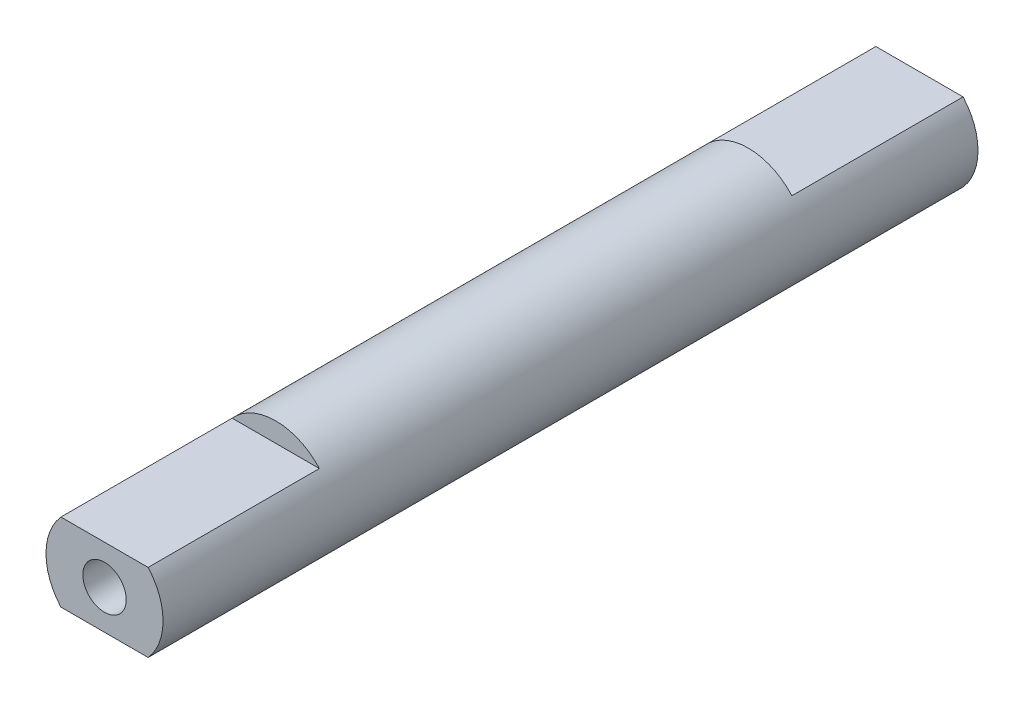
ISO-10303-21;
HEADER;
FILE_DESCRIPTION(('STEP AP214'),'2;1');
FILE_NAME('part.step','',(''),(''),'','','');
FILE_SCHEMA(('AUTOMOTIVE_DESIGN { 1 0 10303 214 1 1 1 1 }'));
ENDSEC;
DATA;
#1=APPLICATION_CONTEXT('core data for automotive mechanical design processes');
#2=APPLICATION_PROTOCOL_DEFINITION('international standard','automotive_design',2000,#1);
#3=PRODUCT_CONTEXT('',#1,'mechanical');
#4=PRODUCT('Part','Part','',(#3));
#5=PRODUCT_RELATED_PRODUCT_CATEGORY('part','',(#4));
#6=PRODUCT_DEFINITION_FORMATION('','',#4);
#7=PRODUCT_DEFINITION_CONTEXT('part definition',#1,'design');
#8=PRODUCT_DEFINITION('design','',#6,#7);
#9=PRODUCT_DEFINITION_SHAPE('','',#8);
#10=(LENGTH_UNIT() NAMED_UNIT(*) SI_UNIT(.MILLI.,.METRE.));
#11=(NAMED_UNIT(*) PLANE_ANGLE_UNIT() SI_UNIT($,.RADIAN.));
#12=(NAMED_UNIT(*) SI_UNIT($,.STERADIAN.) SOLID_ANGLE_UNIT());
#13=UNCERTAINTY_MEASURE_WITH_UNIT(LENGTH_MEASURE(1.E-05),#10,'distance_accuracy_value','');
#14=(GEOMETRIC_REPRESENTATION_CONTEXT(3) GLOBAL_UNCERTAINTY_ASSIGNED_CONTEXT((#13)) GLOBAL_UNIT_ASSIGNED_CONTEXT((#10,
#11,#12)) REPRESENTATION_CONTEXT('',''));
#15=CARTESIAN_POINT('',(0.,0.,0.));
#16=DIRECTION('',(0.,0.,1.));
#17=DIRECTION('',(1.,0.,0.));
#18=AXIS2_PLACEMENT_3D('',#15,#16,#17);
#19=CARTESIAN_POINT('',(0.,0.,18.8));
#20=DIRECTION('',(0.,0.,-1.));
#21=DIRECTION('',(-1.,0.,0.));
#22=AXIS2_PLACEMENT_3D('',#19,#20,#21);
#23=CYLINDRICAL_SURFACE('',#22,2.7);
#24=CARTESIAN_POINT('',(0.,0.,-10.9));
#25=DIRECTION('',(0.,0.,-1.));
#26=DIRECTION('',(-1.,0.,0.));
#27=AXIS2_PLACEMENT_3D('',#24,#25,#26);
#28=CIRCLE('',#27,2.7);
#29=CARTESIAN_POINT('',(-2.01246117974981,1.8,-10.9));
#30=VERTEX_POINT('',#29);
#31=CARTESIAN_POINT('',(2.01246117974981,1.8,-10.9));
#32=VERTEX_POINT('',#31);
#33=EDGE_CURVE('E138',#30,#32,#28,.T.);
#34=ORIENTED_EDGE('',*,*,#33,.F.);
#35=DIRECTION('',(0.,0.,-1.));
#36=VECTOR('',#35,1.);
#37=CARTESIAN_POINT('',(-2.01246117974981,1.8,-10.9));
#38=LINE('',#37,#36);
#39=CARTESIAN_POINT('',(-2.01246117974981,1.8,-18.8));
#40=VERTEX_POINT('',#39);
#41=EDGE_CURVE('E147',#30,#40,#38,.T.);
#42=ORIENTED_EDGE('',*,*,#41,.T.);
#43=CARTESIAN_POINT('',(0.,0.,-18.8));
#44=DIRECTION('',(0.,0.,1.));
#45=DIRECTION('',(1.,0.,0.));
#46=AXIS2_PLACEMENT_3D('',#43,#44,#45);
#47=CIRCLE('',#46,2.7);
#48=CARTESIAN_POINT('',(-2.01246117974981,-1.8,-18.8));
#49=VERTEX_POINT('',#48);
#50=EDGE_CURVE('E164',#40,#49,#47,.T.);
#51=ORIENTED_EDGE('',*,*,#50,.T.);
#52=DIRECTION('',(0.,0.,-1.));
#53=VECTOR('',#52,1.);
#54=CARTESIAN_POINT('',(-2.01246117974981,-1.8,-10.9));
#55=LINE('',#54,#53);
#56=CARTESIAN_POINT('',(-2.01246117974981,-1.8,-10.9));
#57=VERTEX_POINT('',#56);
#58=EDGE_CURVE('E152',#57,#49,#55,.T.);
#59=ORIENTED_EDGE('',*,*,#58,.F.);
#60=CARTESIAN_POINT('',(0.,0.,-10.9));
#61=DIRECTION('',(0.,0.,-1.));
#62=DIRECTION('',(-1.,0.,0.));
#63=AXIS2_PLACEMENT_3D('',#60,#61,#62);
#64=CIRCLE('',#63,2.7);
#65=CARTESIAN_POINT('',(2.01246117974981,-1.8,-10.9));
#66=VERTEX_POINT('',#65);
#67=EDGE_CURVE('E158',#66,#57,#64,.T.);
#68=ORIENTED_EDGE('',*,*,#67,.F.);
#69=DIRECTION('',(0.,0.,-1.));
#70=VECTOR('',#69,1.);
#71=CARTESIAN_POINT('',(2.01246117974981,-1.8,-10.9));
#72=LINE('',#71,#70);
#73=CARTESIAN_POINT('',(2.01246117974981,-1.8,-18.8));
#74=VERTEX_POINT('',#73);
#75=EDGE_CURVE('E124',#66,#74,#72,.T.);
#76=ORIENTED_EDGE('',*,*,#75,.T.);
#77=CARTESIAN_POINT('',(2.01246117974981,1.8,-18.8));
#78=VERTEX_POINT('',#77);
#79=EDGE_CURVE('E47',#74,#78,#47,.T.);
#80=ORIENTED_EDGE('',*,*,#79,.T.);
#81=DIRECTION('',(0.,0.,-1.));
#82=VECTOR('',#81,1.);
#83=CARTESIAN_POINT('',(2.01246117974981,1.8,-10.9));
#84=LINE('',#83,#82);
#85=EDGE_CURVE('E144',#32,#78,#84,.T.);
#86=ORIENTED_EDGE('',*,*,#85,.F.);
#87=EDGE_LOOP('',(#34,#42,#51,#59,#68,#76,#80,#86));
#88=FACE_BOUND('',#87,.T.);
#89=DIRECTION('',(0.,0.,1.));
#90=VECTOR('',#89,1.);
#91=CARTESIAN_POINT('',(2.01246117974981,1.8,10.9));
#92=LINE('',#91,#90);
#93=CARTESIAN_POINT('',(2.01246117974981,1.8,10.9));
#94=VERTEX_POINT('',#93);
#95=CARTESIAN_POINT('',(2.01246117974981,1.8,18.8));
#96=VERTEX_POINT('',#95);
#97=EDGE_CURVE('E112',#94,#96,#92,.T.);
#98=ORIENTED_EDGE('',*,*,#97,.T.);
#99=CARTESIAN_POINT('',(0.,0.,18.8));
#100=DIRECTION('',(0.,0.,1.));
#101=DIRECTION('',(1.,0.,0.));
#102=AXIS2_PLACEMENT_3D('',#99,#100,#101);
#103=CIRCLE('',#102,2.7);
#104=CARTESIAN_POINT('',(2.01246117974981,-1.8,18.8));
#105=VERTEX_POINT('',#104);
#106=EDGE_CURVE('E52',#105,#96,#103,.T.);
#107=ORIENTED_EDGE('',*,*,#106,.F.);
#108=DIRECTION('',(0.,0.,1.));
#109=VECTOR('',#108,1.);
#110=CARTESIAN_POINT('',(2.01246117974981,-1.8,10.9));
#111=LINE('',#110,#109);
#112=CARTESIAN_POINT('',(2.01246117974981,-1.8,10.9));
#113=VERTEX_POINT('',#112);
#114=EDGE_CURVE('E60',#113,#105,#111,.T.);
#115=ORIENTED_EDGE('',*,*,#114,.F.);
#116=CARTESIAN_POINT('',(0.,0.,10.9));
#117=DIRECTION('',(0.,0.,-1.));
#118=DIRECTION('',(-1.,0.,0.));
#119=AXIS2_PLACEMENT_3D('',#116,#117,#118);
#120=CIRCLE('',#119,2.7);
#121=CARTESIAN_POINT('',(-2.01246117974981,-1.8,10.9));
#122=VERTEX_POINT('',#121);
#123=EDGE_CURVE('E128',#113,#122,#120,.T.);
#124=ORIENTED_EDGE('',*,*,#123,.T.);
#125=DIRECTION('',(0.,0.,1.));
#126=VECTOR('',#125,1.);
#127=CARTESIAN_POINT('',(-2.01246117974981,-1.8,10.9));
#128=LINE('',#127,#126);
#129=CARTESIAN_POINT('',(-2.01246117974981,-1.8,18.8));
#130=VERTEX_POINT('',#129);
#131=EDGE_CURVE('E135',#122,#130,#128,.T.);
#132=ORIENTED_EDGE('',*,*,#131,.T.);
#133=CARTESIAN_POINT('',(-2.01246117974981,1.8,18.8));
#134=VERTEX_POINT('',#133);
#135=EDGE_CURVE('E11',#134,#130,#103,.T.);
#136=ORIENTED_EDGE('',*,*,#135,.F.);
#137=DIRECTION('',(0.,0.,1.));
#138=VECTOR('',#137,1.);
#139=CARTESIAN_POINT('',(-2.01246117974981,1.8,10.9));
#140=LINE('',#139,#138);
#141=CARTESIAN_POINT('',(-2.01246117974981,1.8,10.9));
#142=VERTEX_POINT('',#141);
#143=EDGE_CURVE('E68',#142,#134,#140,.T.);
#144=ORIENTED_EDGE('',*,*,#143,.F.);
#145=CARTESIAN_POINT('',(0.,0.,10.9));
#146=DIRECTION('',(0.,0.,-1.));
#147=DIRECTION('',(-1.,0.,0.));
#148=AXIS2_PLACEMENT_3D('',#145,#146,#147);
#149=CIRCLE('',#148,2.7);
#150=EDGE_CURVE('E115',#142,#94,#149,.T.);
#151=ORIENTED_EDGE('',*,*,#150,.T.);
#152=EDGE_LOOP('',(#98,#107,#115,#124,#132,#136,#144,#151));
#153=FACE_BOUND('',#152,.T.);
#154=ADVANCED_FACE('F43',(#88,#153),#23,.T.);
#155=CARTESIAN_POINT('',(0.,0.,18.8));
#156=DIRECTION('',(0.,0.,1.));
#157=DIRECTION('',(1.,0.,0.));
#158=AXIS2_PLACEMENT_3D('',#155,#156,#157);
#159=PLANE('',#158);
#160=CARTESIAN_POINT('',(0.,0.,18.8));
#161=DIRECTION('',(0.,0.,1.));
#162=DIRECTION('',(1.,0.,0.));
#163=AXIS2_PLACEMENT_3D('',#160,#161,#162);
#164=CIRCLE('',#163,1.);
#165=CARTESIAN_POINT('',(1.,0.,18.8));
#166=VERTEX_POINT('',#165);
#167=EDGE_CURVE('E162',#166,#166,#164,.T.);
#168=ORIENTED_EDGE('',*,*,#167,.F.);
#169=EDGE_LOOP('',(#168));
#170=FACE_BOUND('',#169,.T.);
#171=ORIENTED_EDGE('',*,*,#106,.T.);
#172=DIRECTION('',(-1.,0.,0.));
#173=VECTOR('',#172,1.);
#174=CARTESIAN_POINT('',(2.01246117974981,1.8,18.8));
#175=LINE('',#174,#173);
#176=EDGE_CURVE('E119',#96,#134,#175,.T.);
#177=ORIENTED_EDGE('',*,*,#176,.T.);
#178=ORIENTED_EDGE('',*,*,#135,.T.);
#179=DIRECTION('',(1.,0.,0.));
#180=VECTOR('',#179,1.);
#181=CARTESIAN_POINT('',(2.01246117974981,-1.8,18.8));
#182=LINE('',#181,#180);
#183=EDGE_CURVE('E132',#130,#105,#182,.T.);
#184=ORIENTED_EDGE('',*,*,#183,.T.);
#185=EDGE_LOOP('',(#171,#177,#178,#184));
#186=FACE_BOUND('',#185,.T.);
#187=ADVANCED_FACE('F200',(#170,#186),#159,.T.);
#188=CARTESIAN_POINT('',(0.,0.,18.8));
#189=DIRECTION('',(0.,0.,-1.));
#190=DIRECTION('',(-1.,0.,0.));
#191=AXIS2_PLACEMENT_3D('',#188,#189,#190);
#192=CYLINDRICAL_SURFACE('',#191,1.);
#193=ORIENTED_EDGE('',*,*,#167,.T.);
#194=EDGE_LOOP('',(#193));
#195=FACE_BOUND('',#194,.T.);
#196=CARTESIAN_POINT('',(0.,0.,-18.8));
#197=DIRECTION('',(0.,0.,1.));
#198=DIRECTION('',(1.,0.,0.));
#199=AXIS2_PLACEMENT_3D('',#196,#197,#198);
#200=CIRCLE('',#199,1.);
#201=CARTESIAN_POINT('',(1.,0.,-18.8));
#202=VERTEX_POINT('',#201);
#203=EDGE_CURVE('E150',#202,#202,#200,.T.);
#204=ORIENTED_EDGE('',*,*,#203,.F.);
#205=EDGE_LOOP('',(#204));
#206=FACE_BOUND('',#205,.T.);
#207=ADVANCED_FACE('F45',(#195,#206),#192,.F.);
#208=CARTESIAN_POINT('',(0.,0.,-18.8));
#209=DIRECTION('',(0.,0.,1.));
#210=DIRECTION('',(1.,0.,0.));
#211=AXIS2_PLACEMENT_3D('',#208,#209,#210);
#212=PLANE('',#211);
#213=ORIENTED_EDGE('',*,*,#203,.T.);
#214=EDGE_LOOP('',(#213));
#215=FACE_BOUND('',#214,.T.);
#216=ORIENTED_EDGE('',*,*,#50,.F.);
#217=DIRECTION('',(-1.,0.,0.));
#218=VECTOR('',#217,1.);
#219=CARTESIAN_POINT('',(2.01246117974981,1.8,-18.8));
#220=LINE('',#219,#218);
#221=EDGE_CURVE('E141',#78,#40,#220,.T.);
#222=ORIENTED_EDGE('',*,*,#221,.F.);
#223=ORIENTED_EDGE('',*,*,#79,.F.);
#224=DIRECTION('',(1.,0.,0.));
#225=VECTOR('',#224,1.);
#226=CARTESIAN_POINT('',(2.01246117974981,-1.8,-18.8));
#227=LINE('',#226,#225);
#228=EDGE_CURVE('E146',#49,#74,#227,.T.);
#229=ORIENTED_EDGE('',*,*,#228,.F.);
#230=EDGE_LOOP('',(#216,#222,#223,#229));
#231=FACE_BOUND('',#230,.T.);
#232=ADVANCED_FACE('F181',(#215,#231),#212,.F.);
#233=CARTESIAN_POINT('',(2.01246117974981,-1.8,-10.9));
#234=DIRECTION('',(0.,1.,0.));
#235=DIRECTION('',(0.,0.,1.));
#236=AXIS2_PLACEMENT_3D('',#233,#234,#235);
#237=PLANE('',#236);
#238=ORIENTED_EDGE('',*,*,#228,.T.);
#239=ORIENTED_EDGE('',*,*,#75,.F.);
#240=DIRECTION('',(1.,0.,0.));
#241=VECTOR('',#240,1.);
#242=CARTESIAN_POINT('',(2.01246117974981,-1.8,-10.9));
#243=LINE('',#242,#241);
#244=EDGE_CURVE('E154',#57,#66,#243,.T.);
#245=ORIENTED_EDGE('',*,*,#244,.F.);
#246=ORIENTED_EDGE('',*,*,#58,.T.);
#247=EDGE_LOOP('',(#238,#239,#245,#246));
#248=FACE_BOUND('',#247,.T.);
#249=ADVANCED_FACE('F183',(#248),#237,.F.);
#250=CARTESIAN_POINT('',(0.,0.,-10.9));
#251=DIRECTION('',(0.,0.,-1.));
#252=DIRECTION('',(-1.,0.,0.));
#253=AXIS2_PLACEMENT_3D('',#250,#251,#252);
#254=PLANE('',#253);
#255=ORIENTED_EDGE('',*,*,#67,.T.);
#256=ORIENTED_EDGE('',*,*,#244,.T.);
#257=EDGE_LOOP('',(#255,#256));
#258=FACE_BOUND('',#257,.T.);
#259=ADVANCED_FACE('F186',(#258),#254,.T.);
#260=CARTESIAN_POINT('',(2.01246117974981,1.8,-10.9));
#261=DIRECTION('',(0.,-1.,0.));
#262=DIRECTION('',(0.,0.,-1.));
#263=AXIS2_PLACEMENT_3D('',#260,#261,#262);
#264=PLANE('',#263);
#265=ORIENTED_EDGE('',*,*,#221,.T.);
#266=ORIENTED_EDGE('',*,*,#41,.F.);
#267=DIRECTION('',(-1.,0.,0.));
#268=VECTOR('',#267,1.);
#269=CARTESIAN_POINT('',(2.01246117974981,1.8,-10.9));
#270=LINE('',#269,#268);
#271=EDGE_CURVE('E140',#32,#30,#270,.T.);
#272=ORIENTED_EDGE('',*,*,#271,.F.);
#273=ORIENTED_EDGE('',*,*,#85,.T.);
#274=EDGE_LOOP('',(#265,#266,#272,#273));
#275=FACE_BOUND('',#274,.T.);
#276=ADVANCED_FACE('F188',(#275),#264,.F.);
#277=CARTESIAN_POINT('',(0.,0.,-10.9));
#278=DIRECTION('',(0.,0.,-1.));
#279=DIRECTION('',(-1.,0.,0.));
#280=AXIS2_PLACEMENT_3D('',#277,#278,#279);
#281=PLANE('',#280);
#282=ORIENTED_EDGE('',*,*,#33,.T.);
#283=ORIENTED_EDGE('',*,*,#271,.T.);
#284=EDGE_LOOP('',(#282,#283));
#285=FACE_BOUND('',#284,.T.);
#286=ADVANCED_FACE('F194',(#285),#281,.T.);
#287=CARTESIAN_POINT('',(2.01246117974981,-1.8,10.9));
#288=DIRECTION('',(0.,-1.,0.));
#289=DIRECTION('',(0.,0.,-1.));
#290=AXIS2_PLACEMENT_3D('',#287,#288,#289);
#291=PLANE('',#290);
#292=ORIENTED_EDGE('',*,*,#183,.F.);
#293=ORIENTED_EDGE('',*,*,#131,.F.);
#294=DIRECTION('',(1.,0.,0.));
#295=VECTOR('',#294,1.);
#296=CARTESIAN_POINT('',(2.01246117974981,-1.8,10.9));
#297=LINE('',#296,#295);
#298=EDGE_CURVE('E131',#122,#113,#297,.T.);
#299=ORIENTED_EDGE('',*,*,#298,.T.);
#300=ORIENTED_EDGE('',*,*,#114,.T.);
#301=EDGE_LOOP('',(#292,#293,#299,#300));
#302=FACE_BOUND('',#301,.T.);
#303=ADVANCED_FACE('F222',(#302),#291,.T.);
#304=CARTESIAN_POINT('',(0.,0.,10.9));
#305=DIRECTION('',(0.,0.,1.));
#306=DIRECTION('',(-1.,0.,0.));
#307=AXIS2_PLACEMENT_3D('',#304,#305,#306);
#308=PLANE('',#307);
#309=ORIENTED_EDGE('',*,*,#123,.F.);
#310=ORIENTED_EDGE('',*,*,#298,.F.);
#311=EDGE_LOOP('',(#309,#310));
#312=FACE_BOUND('',#311,.T.);
#313=ADVANCED_FACE('F221',(#312),#308,.T.);
#314=CARTESIAN_POINT('',(2.01246117974981,1.8,10.9));
#315=DIRECTION('',(0.,1.,0.));
#316=DIRECTION('',(0.,0.,1.));
#317=AXIS2_PLACEMENT_3D('',#314,#315,#316);
#318=PLANE('',#317);
#319=ORIENTED_EDGE('',*,*,#176,.F.);
#320=ORIENTED_EDGE('',*,*,#97,.F.);
#321=DIRECTION('',(-1.,0.,0.));
#322=VECTOR('',#321,1.);
#323=CARTESIAN_POINT('',(2.01246117974981,1.8,10.9));
#324=LINE('',#323,#322);
#325=EDGE_CURVE('E108',#94,#142,#324,.T.);
#326=ORIENTED_EDGE('',*,*,#325,.T.);
#327=ORIENTED_EDGE('',*,*,#143,.T.);
#328=EDGE_LOOP('',(#319,#320,#326,#327));
#329=FACE_BOUND('',#328,.T.);
#330=ADVANCED_FACE('F110',(#329),#318,.T.);
#331=CARTESIAN_POINT('',(0.,0.,10.9));
#332=DIRECTION('',(0.,0.,1.));
#333=DIRECTION('',(-1.,0.,0.));
#334=AXIS2_PLACEMENT_3D('',#331,#332,#333);
#335=PLANE('',#334);
#336=ORIENTED_EDGE('',*,*,#150,.F.);
#337=ORIENTED_EDGE('',*,*,#325,.F.);
#338=EDGE_LOOP('',(#336,#337));
#339=FACE_BOUND('',#338,.T.);
#340=ADVANCED_FACE('F117',(#339),#335,.T.);
#341=CLOSED_SHELL('',(#154,#187,#207,#232,#249,#259,#276,#286,#303,#313,#330,#340));
#342=MANIFOLD_SOLID_BREP('B2',#341);
#343=ADVANCED_BREP_SHAPE_REPRESENTATION('',(#18,#342),#14);
#344=SHAPE_DEFINITION_REPRESENTATION(#9,#343);
ENDSEC;
END-ISO-10303-21;
